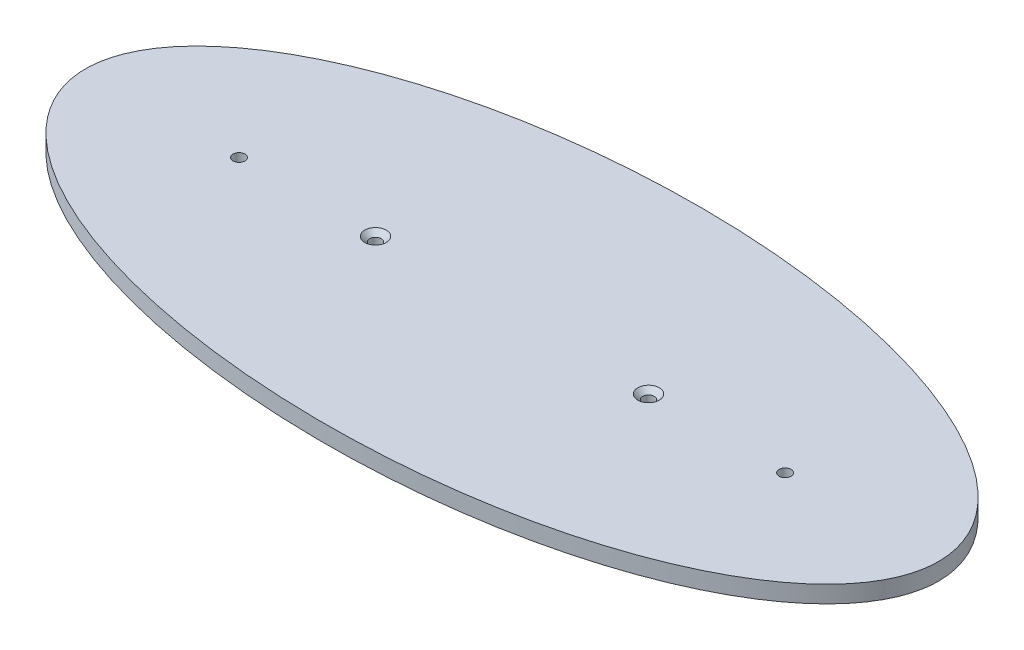
ISO-10303-21;
HEADER;
FILE_DESCRIPTION(('STEP AP214'),'2;1');
FILE_NAME('part.step','',(''),(''),'','','');
FILE_SCHEMA(('AUTOMOTIVE_DESIGN { 1 0 10303 214 1 1 1 1 }'));
ENDSEC;
DATA;
#1=APPLICATION_CONTEXT('core data for automotive mechanical design processes');
#2=APPLICATION_PROTOCOL_DEFINITION('international standard','automotive_design',2000,#1);
#3=PRODUCT_CONTEXT('',#1,'mechanical');
#4=PRODUCT('Part','Part','',(#3));
#5=PRODUCT_RELATED_PRODUCT_CATEGORY('part','',(#4));
#6=PRODUCT_DEFINITION_FORMATION('','',#4);
#7=PRODUCT_DEFINITION_CONTEXT('part definition',#1,'design');
#8=PRODUCT_DEFINITION('design','',#6,#7);
#9=PRODUCT_DEFINITION_SHAPE('','',#8);
#10=(LENGTH_UNIT() NAMED_UNIT(*) SI_UNIT(.MILLI.,.METRE.));
#11=(NAMED_UNIT(*) PLANE_ANGLE_UNIT() SI_UNIT($,.RADIAN.));
#12=(NAMED_UNIT(*) SI_UNIT($,.STERADIAN.) SOLID_ANGLE_UNIT());
#13=UNCERTAINTY_MEASURE_WITH_UNIT(LENGTH_MEASURE(1.E-05),#10,'distance_accuracy_value','');
#14=(GEOMETRIC_REPRESENTATION_CONTEXT(3) GLOBAL_UNCERTAINTY_ASSIGNED_CONTEXT((#13)) GLOBAL_UNIT_ASSIGNED_CONTEXT((#10,
#11,#12)) REPRESENTATION_CONTEXT('',''));
#15=CARTESIAN_POINT('',(0.,0.,0.));
#16=DIRECTION('',(0.,0.,1.));
#17=DIRECTION('',(1.,0.,0.));
#18=AXIS2_PLACEMENT_3D('',#15,#16,#17);
#19=CARTESIAN_POINT('',(0.,5.,0.));
#20=DIRECTION('',(0.,1.,0.));
#21=DIRECTION('',(1.,0.,0.));
#22=AXIS2_PLACEMENT_3D('',#19,#20,#21);
#23=ELLIPSE('',#22,125.,55.);
#24=DIRECTION('',(0.,-1.,0.));
#25=VECTOR('',#24,1.);
#26=SURFACE_OF_LINEAR_EXTRUSION('',#23,#25);
#27=CARTESIAN_POINT('',(125.,5.,0.));
#28=VERTEX_POINT('',#27);
#29=EDGE_CURVE('E10',#28,#28,#23,.T.);
#30=ORIENTED_EDGE('',*,*,#29,.F.);
#31=EDGE_LOOP('',(#30));
#32=FACE_BOUND('',#31,.T.);
#33=CARTESIAN_POINT('',(0.,0.,0.));
#34=DIRECTION('',(0.,1.,0.));
#35=DIRECTION('',(1.,0.,0.));
#36=AXIS2_PLACEMENT_3D('',#33,#34,#35);
#37=ELLIPSE('',#36,125.,55.);
#38=CARTESIAN_POINT('',(125.,0.,0.));
#39=VERTEX_POINT('',#38);
#40=EDGE_CURVE('E33',#39,#39,#37,.T.);
#41=ORIENTED_EDGE('',*,*,#40,.T.);
#42=EDGE_LOOP('',(#41));
#43=FACE_BOUND('',#42,.T.);
#44=ADVANCED_FACE('F29',(#32,#43),#26,.F.);
#45=CARTESIAN_POINT('',(0.,5.,0.));
#46=DIRECTION('',(0.,1.,0.));
#47=DIRECTION('',(0.,0.,1.));
#48=AXIS2_PLACEMENT_3D('',#45,#46,#47);
#49=PLANE('',#48);
#50=CARTESIAN_POINT('',(80.,5.,0.));
#51=DIRECTION('',(0.,1.,0.));
#52=DIRECTION('',(0.,0.,1.));
#53=AXIS2_PLACEMENT_3D('',#50,#51,#52);
#54=CIRCLE('',#53,1.75);
#55=CARTESIAN_POINT('',(80.,5.,1.75));
#56=VERTEX_POINT('',#55);
#57=EDGE_CURVE('E66',#56,#56,#54,.T.);
#58=ORIENTED_EDGE('',*,*,#57,.F.);
#59=EDGE_LOOP('',(#58));
#60=FACE_BOUND('',#59,.T.);
#61=CARTESIAN_POINT('',(-80.,5.,0.));
#62=DIRECTION('',(0.,1.,0.));
#63=DIRECTION('',(0.,0.,1.));
#64=AXIS2_PLACEMENT_3D('',#61,#62,#63);
#65=CIRCLE('',#64,1.75);
#66=CARTESIAN_POINT('',(-80.,5.,1.75));
#67=VERTEX_POINT('',#66);
#68=EDGE_CURVE('E60',#67,#67,#65,.T.);
#69=ORIENTED_EDGE('',*,*,#68,.F.);
#70=EDGE_LOOP('',(#69));
#71=FACE_BOUND('',#70,.T.);
#72=CARTESIAN_POINT('',(-40.,5.,0.));
#73=DIRECTION('',(0.,1.,0.));
#74=DIRECTION('',(0.,0.,1.));
#75=AXIS2_PLACEMENT_3D('',#72,#73,#74);
#76=CIRCLE('',#75,3.15);
#77=CARTESIAN_POINT('',(-40.,5.,3.15));
#78=VERTEX_POINT('',#77);
#79=EDGE_CURVE('E56',#78,#78,#76,.T.);
#80=ORIENTED_EDGE('',*,*,#79,.F.);
#81=EDGE_LOOP('',(#80));
#82=FACE_BOUND('',#81,.T.);
#83=CARTESIAN_POINT('',(40.,5.,0.));
#84=DIRECTION('',(0.,1.,0.));
#85=DIRECTION('',(0.,0.,1.));
#86=AXIS2_PLACEMENT_3D('',#83,#84,#85);
#87=CIRCLE('',#86,3.15);
#88=CARTESIAN_POINT('',(40.,5.,3.15));
#89=VERTEX_POINT('',#88);
#90=EDGE_CURVE('E47',#89,#89,#87,.T.);
#91=ORIENTED_EDGE('',*,*,#90,.F.);
#92=EDGE_LOOP('',(#91));
#93=FACE_BOUND('',#92,.T.);
#94=ORIENTED_EDGE('',*,*,#29,.T.);
#95=EDGE_LOOP('',(#94));
#96=FACE_BOUND('',#95,.T.);
#97=ADVANCED_FACE('F82',(#60,#71,#82,#93,#96),#49,.T.);
#98=CARTESIAN_POINT('',(0.,0.,0.));
#99=DIRECTION('',(0.,1.,0.));
#100=DIRECTION('',(0.,0.,1.));
#101=AXIS2_PLACEMENT_3D('',#98,#99,#100);
#102=PLANE('',#101);
#103=CARTESIAN_POINT('',(80.,0.,0.));
#104=DIRECTION('',(0.,1.,0.));
#105=DIRECTION('',(0.,0.,1.));
#106=AXIS2_PLACEMENT_3D('',#103,#104,#105);
#107=CIRCLE('',#106,1.75);
#108=CARTESIAN_POINT('',(80.,0.,1.75));
#109=VERTEX_POINT('',#108);
#110=EDGE_CURVE('E63',#109,#109,#107,.T.);
#111=ORIENTED_EDGE('',*,*,#110,.T.);
#112=EDGE_LOOP('',(#111));
#113=FACE_BOUND('',#112,.T.);
#114=CARTESIAN_POINT('',(-80.,0.,0.));
#115=DIRECTION('',(0.,1.,0.));
#116=DIRECTION('',(0.,0.,1.));
#117=AXIS2_PLACEMENT_3D('',#114,#115,#116);
#118=CIRCLE('',#117,1.75);
#119=CARTESIAN_POINT('',(-80.,0.,1.75));
#120=VERTEX_POINT('',#119);
#121=EDGE_CURVE('E59',#120,#120,#118,.T.);
#122=ORIENTED_EDGE('',*,*,#121,.T.);
#123=EDGE_LOOP('',(#122));
#124=FACE_BOUND('',#123,.T.);
#125=CARTESIAN_POINT('',(-40.,0.,0.));
#126=DIRECTION('',(0.,1.,0.));
#127=DIRECTION('',(0.,0.,1.));
#128=AXIS2_PLACEMENT_3D('',#125,#126,#127);
#129=CIRCLE('',#128,1.7);
#130=CARTESIAN_POINT('',(-40.,0.,1.7));
#131=VERTEX_POINT('',#130);
#132=EDGE_CURVE('E50',#131,#131,#129,.T.);
#133=ORIENTED_EDGE('',*,*,#132,.T.);
#134=EDGE_LOOP('',(#133));
#135=FACE_BOUND('',#134,.T.);
#136=CARTESIAN_POINT('',(40.,0.,0.));
#137=DIRECTION('',(0.,1.,0.));
#138=DIRECTION('',(0.,0.,1.));
#139=AXIS2_PLACEMENT_3D('',#136,#137,#138);
#140=CIRCLE('',#139,1.7);
#141=CARTESIAN_POINT('',(40.,0.,1.7));
#142=VERTEX_POINT('',#141);
#143=EDGE_CURVE('E39',#142,#142,#140,.T.);
#144=ORIENTED_EDGE('',*,*,#143,.T.);
#145=EDGE_LOOP('',(#144));
#146=FACE_BOUND('',#145,.T.);
#147=ORIENTED_EDGE('',*,*,#40,.F.);
#148=EDGE_LOOP('',(#147));
#149=FACE_BOUND('',#148,.T.);
#150=ADVANCED_FACE('F72',(#113,#124,#135,#146,#149),#102,.F.);
#151=CARTESIAN_POINT('',(40.,5.,0.));
#152=DIRECTION('',(0.,1.,0.));
#153=DIRECTION('',(0.,0.,1.));
#154=AXIS2_PLACEMENT_3D('',#151,#152,#153);
#155=CYLINDRICAL_SURFACE('',#154,1.7);
#156=ORIENTED_EDGE('',*,*,#143,.F.);
#157=EDGE_LOOP('',(#156));
#158=FACE_BOUND('',#157,.T.);
#159=CARTESIAN_POINT('',(40.,3.55,0.));
#160=DIRECTION('',(0.,1.,0.));
#161=DIRECTION('',(0.,0.,1.));
#162=AXIS2_PLACEMENT_3D('',#159,#160,#161);
#163=CIRCLE('',#162,1.7);
#164=CARTESIAN_POINT('',(40.,3.55,1.7));
#165=VERTEX_POINT('',#164);
#166=EDGE_CURVE('E44',#165,#165,#163,.T.);
#167=ORIENTED_EDGE('',*,*,#166,.T.);
#168=EDGE_LOOP('',(#167));
#169=FACE_BOUND('',#168,.T.);
#170=ADVANCED_FACE('F95',(#158,#169),#155,.F.);
#171=CARTESIAN_POINT('',(40.,5.,0.));
#172=DIRECTION('',(0.,1.,0.));
#173=DIRECTION('',(0.,0.,1.));
#174=AXIS2_PLACEMENT_3D('',#171,#172,#173);
#175=CONICAL_SURFACE('',#174,3.15,0.785398163397447);
#176=ORIENTED_EDGE('',*,*,#166,.F.);
#177=EDGE_LOOP('',(#176));
#178=FACE_BOUND('',#177,.T.);
#179=ORIENTED_EDGE('',*,*,#90,.T.);
#180=EDGE_LOOP('',(#179));
#181=FACE_BOUND('',#180,.T.);
#182=ADVANCED_FACE('F92',(#178,#181),#175,.F.);
#183=CARTESIAN_POINT('',(-40.,5.,0.));
#184=DIRECTION('',(0.,1.,0.));
#185=DIRECTION('',(0.,0.,1.));
#186=AXIS2_PLACEMENT_3D('',#183,#184,#185);
#187=CYLINDRICAL_SURFACE('',#186,1.7);
#188=ORIENTED_EDGE('',*,*,#132,.F.);
#189=EDGE_LOOP('',(#188));
#190=FACE_BOUND('',#189,.T.);
#191=CARTESIAN_POINT('',(-40.,3.55,0.));
#192=DIRECTION('',(0.,1.,0.));
#193=DIRECTION('',(0.,0.,1.));
#194=AXIS2_PLACEMENT_3D('',#191,#192,#193);
#195=CIRCLE('',#194,1.7);
#196=CARTESIAN_POINT('',(-40.,3.55,1.7));
#197=VERTEX_POINT('',#196);
#198=EDGE_CURVE('E53',#197,#197,#195,.T.);
#199=ORIENTED_EDGE('',*,*,#198,.T.);
#200=EDGE_LOOP('',(#199));
#201=FACE_BOUND('',#200,.T.);
#202=ADVANCED_FACE('F94',(#190,#201),#187,.F.);
#203=CARTESIAN_POINT('',(-40.,5.,0.));
#204=DIRECTION('',(0.,1.,0.));
#205=DIRECTION('',(0.,0.,1.));
#206=AXIS2_PLACEMENT_3D('',#203,#204,#205);
#207=CONICAL_SURFACE('',#206,3.15,0.785398163397447);
#208=ORIENTED_EDGE('',*,*,#198,.F.);
#209=EDGE_LOOP('',(#208));
#210=FACE_BOUND('',#209,.T.);
#211=ORIENTED_EDGE('',*,*,#79,.T.);
#212=EDGE_LOOP('',(#211));
#213=FACE_BOUND('',#212,.T.);
#214=ADVANCED_FACE('F102',(#210,#213),#207,.F.);
#215=CARTESIAN_POINT('',(-80.,0.,0.));
#216=DIRECTION('',(0.,1.,0.));
#217=DIRECTION('',(0.,0.,1.));
#218=AXIS2_PLACEMENT_3D('',#215,#216,#217);
#219=CYLINDRICAL_SURFACE('',#218,1.75);
#220=ORIENTED_EDGE('',*,*,#121,.F.);
#221=EDGE_LOOP('',(#220));
#222=FACE_BOUND('',#221,.T.);
#223=ORIENTED_EDGE('',*,*,#68,.T.);
#224=EDGE_LOOP('',(#223));
#225=FACE_BOUND('',#224,.T.);
#226=ADVANCED_FACE('F78',(#222,#225),#219,.F.);
#227=CARTESIAN_POINT('',(80.,0.,0.));
#228=DIRECTION('',(0.,1.,0.));
#229=DIRECTION('',(0.,0.,1.));
#230=AXIS2_PLACEMENT_3D('',#227,#228,#229);
#231=CYLINDRICAL_SURFACE('',#230,1.75);
#232=ORIENTED_EDGE('',*,*,#110,.F.);
#233=EDGE_LOOP('',(#232));
#234=FACE_BOUND('',#233,.T.);
#235=ORIENTED_EDGE('',*,*,#57,.T.);
#236=EDGE_LOOP('',(#235));
#237=FACE_BOUND('',#236,.T.);
#238=ADVANCED_FACE('F75',(#234,#237),#231,.F.);
#239=CLOSED_SHELL('',(#44,#97,#150,#170,#182,#202,#214,#226,#238));
#240=MANIFOLD_SOLID_BREP('B2',#239);
#241=ADVANCED_BREP_SHAPE_REPRESENTATION('',(#18,#240),#14);
#242=SHAPE_DEFINITION_REPRESENTATION(#9,#241);
ENDSEC;
END-ISO-10303-21;
